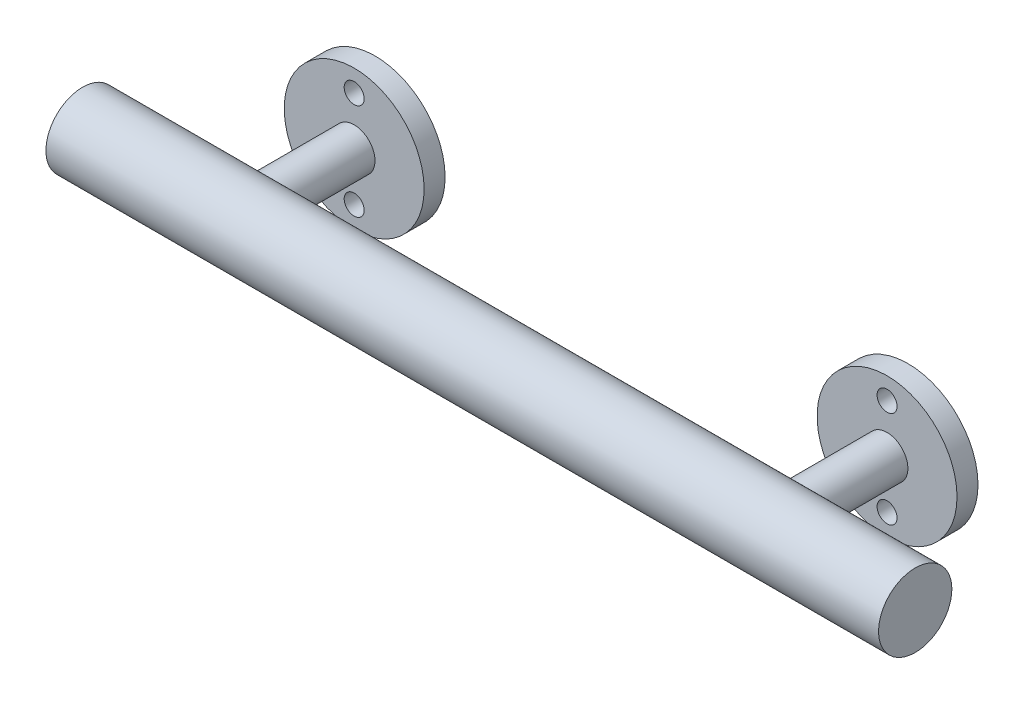
ISO-10303-21;
HEADER;
FILE_DESCRIPTION(('STEP AP214'),'2;1');
FILE_NAME('part.step','',(''),(''),'','','');
FILE_SCHEMA(('AUTOMOTIVE_DESIGN { 1 0 10303 214 1 1 1 1 }'));
ENDSEC;
DATA;
#1=APPLICATION_CONTEXT('core data for automotive mechanical design processes');
#2=APPLICATION_PROTOCOL_DEFINITION('international standard','automotive_design',2000,#1);
#3=PRODUCT_CONTEXT('',#1,'mechanical');
#4=PRODUCT('Part','Part','',(#3));
#5=PRODUCT_RELATED_PRODUCT_CATEGORY('part','',(#4));
#6=PRODUCT_DEFINITION_FORMATION('','',#4);
#7=PRODUCT_DEFINITION_CONTEXT('part definition',#1,'design');
#8=PRODUCT_DEFINITION('design','',#6,#7);
#9=PRODUCT_DEFINITION_SHAPE('','',#8);
#10=(LENGTH_UNIT() NAMED_UNIT(*) SI_UNIT(.MILLI.,.METRE.));
#11=(NAMED_UNIT(*) PLANE_ANGLE_UNIT() SI_UNIT($,.RADIAN.));
#12=(NAMED_UNIT(*) SI_UNIT($,.STERADIAN.) SOLID_ANGLE_UNIT());
#13=UNCERTAINTY_MEASURE_WITH_UNIT(LENGTH_MEASURE(1.E-05),#10,'distance_accuracy_value','');
#14=(GEOMETRIC_REPRESENTATION_CONTEXT(3) GLOBAL_UNCERTAINTY_ASSIGNED_CONTEXT((#13)) GLOBAL_UNIT_ASSIGNED_CONTEXT((#10,
#11,#12)) REPRESENTATION_CONTEXT('',''));
#15=CARTESIAN_POINT('',(0.,0.,0.));
#16=DIRECTION('',(0.,0.,1.));
#17=DIRECTION('',(1.,0.,0.));
#18=AXIS2_PLACEMENT_3D('',#15,#16,#17);
#19=CARTESIAN_POINT('',(-110.,0.,42.0519334951158));
#20=DIRECTION('',(1.,0.,0.));
#21=DIRECTION('',(0.,0.,-1.));
#22=AXIS2_PLACEMENT_3D('',#19,#20,#21);
#23=CYLINDRICAL_SURFACE('',#22,11.);
#24=CARTESIAN_POINT('',(140.,0.,42.0519334951158));
#25=DIRECTION('',(1.,0.,0.));
#26=DIRECTION('',(0.,0.,-1.));
#27=AXIS2_PLACEMENT_3D('',#24,#25,#26);
#28=CIRCLE('',#27,11.);
#29=CARTESIAN_POINT('',(140.,0.,31.0519334951158));
#30=VERTEX_POINT('',#29);
#31=EDGE_CURVE('E101',#30,#30,#28,.T.);
#32=ORIENTED_EDGE('',*,*,#31,.F.);
#33=EDGE_LOOP('',(#32));
#34=FACE_BOUND('',#33,.T.);
#35=CARTESIAN_POINT('',(-110.,0.,42.0519334951158));
#36=DIRECTION('',(1.,0.,0.));
#37=DIRECTION('',(0.,0.,-1.));
#38=AXIS2_PLACEMENT_3D('',#35,#36,#37);
#39=CIRCLE('',#38,11.);
#40=CARTESIAN_POINT('',(-110.,0.,31.0519334951158));
#41=VERTEX_POINT('',#40);
#42=EDGE_CURVE('E104',#41,#41,#39,.T.);
#43=ORIENTED_EDGE('',*,*,#42,.T.);
#44=EDGE_LOOP('',(#43));
#45=FACE_BOUND('',#44,.T.);
#46=CARTESIAN_POINT('',(-64.2026431718062,6.25,33.));
#47=CARTESIAN_POINT('',(-64.0434405837907,6.24999937136487,32.9999991187482));
#48=CARTESIAN_POINT('',(-63.8842289150577,6.24390777915526,32.9957843524336));
#49=CARTESIAN_POINT('',(-63.5671634941966,6.21964253217894,32.979102698203));
#50=CARTESIAN_POINT('',(-63.4093098564348,6.20146786973566,32.9666351220381));
#51=CARTESIAN_POINT('',(-63.0961251432963,6.15331116050535,32.9339509796096));
#52=CARTESIAN_POINT('',(-62.9407959134038,6.12332084739676,32.9137289885617));
#53=CARTESIAN_POINT('',(-62.6338082885961,6.05195075629456,32.8663075782992));
#54=CARTESIAN_POINT('',(-62.4821515617625,6.01056590458998,32.8391050511894));
#55=CARTESIAN_POINT('',(-62.1845101857211,5.91724560049291,32.7788940145012));
#56=CARTESIAN_POINT('',(-62.0384935538908,5.86538512178775,32.7459269748142));
#57=CARTESIAN_POINT('',(-61.7517052081969,5.75145466479171,32.6750860210497));
#58=CARTESIAN_POINT('',(-61.6109354641773,5.68938089853994,32.6372102875195));
#59=CARTESIAN_POINT('',(-61.1974442056008,5.48863558914412,32.5178310238935));
#60=CARTESIAN_POINT('',(-60.9333480797537,5.3353788468308,32.430534086262));
#61=CARTESIAN_POINT('',(-60.4046356026273,4.97501995072822,32.2389280958422));
#62=CARTESIAN_POINT('',(-60.1430673381843,4.76388137018914,32.1338007582532));
#63=CARTESIAN_POINT('',(-59.7784181971214,4.41779038731103,31.9772492497927));
#64=CARTESIAN_POINT('',(-59.6614184363048,4.29744143355594,31.9252217667893));
#65=CARTESIAN_POINT('',(-59.4371393923202,4.0473056773403,31.8226830588214));
#66=CARTESIAN_POINT('',(-59.3298617908834,3.91751724901943,31.7721720971901));
#67=CARTESIAN_POINT('',(-59.1161073719666,3.63643881645987,31.6692185605069));
#68=CARTESIAN_POINT('',(-59.0106511012825,3.48427411264601,31.6170397794352));
#69=CARTESIAN_POINT('',(-58.8131048551951,3.17013906047401,31.5173545103875));
#70=CARTESIAN_POINT('',(-58.7210089948424,3.00817307417766,31.4698459682713));
#71=CARTESIAN_POINT('',(-58.5511213936663,2.67538553838118,31.3808527518929));
#72=CARTESIAN_POINT('',(-58.4733244532826,2.5045672369571,31.3393658891076));
#73=CARTESIAN_POINT('',(-58.3329826870095,2.15522690496327,31.2636565000364));
#74=CARTESIAN_POINT('',(-58.2704356665899,1.97670598719057,31.2294329286229));
#75=CARTESIAN_POINT('',(-58.1662810699126,1.62934678494944,31.1719770132301));
#76=CARTESIAN_POINT('',(-58.1233192998897,1.46102994572393,31.1480445266223));
#77=CARTESIAN_POINT('',(-58.0514478642795,1.12052009295118,31.1078111262122));
#78=CARTESIAN_POINT('',(-58.02253744857,0.94832728683347,31.0915098050269));
#79=CARTESIAN_POINT('',(-57.979221093909,0.60167210321689,31.0670273417006));
#80=CARTESIAN_POINT('',(-57.9648052351433,0.427211360792804,31.0588406461103));
#81=CARTESIAN_POINT('',(-57.9506749940271,0.0775095769239728,31.0508167248438));
#82=CARTESIAN_POINT('',(-57.9509593355302,-0.0977313954671912,31.0509787744005));
#83=CARTESIAN_POINT('',(-57.9653630850676,-0.427778552495635,31.0591568838607));
#84=CARTESIAN_POINT('',(-57.9779309628998,-0.582677326115649,31.0662921497533));
#85=CARTESIAN_POINT('',(-58.0144975308529,-0.890740469322179,31.0869702929905));
#86=CARTESIAN_POINT('',(-58.0384999931855,-1.04390424945981,31.1005152848616));
#87=CARTESIAN_POINT('',(-58.0976384169811,-1.3473316216047,31.1336925627294));
#88=CARTESIAN_POINT('',(-58.1327704418333,-1.49759621916787,31.1533226963128));
#89=CARTESIAN_POINT('',(-58.2137907691425,-1.7943861899477,31.1982374777327));
#90=CARTESIAN_POINT('',(-58.2596832674728,-1.94091007975833,31.2235243311391));
#91=CARTESIAN_POINT('',(-58.3622001048363,-2.23059038731292,31.2794494968235));
#92=CARTESIAN_POINT('',(-58.4189147931651,-2.37370614573285,31.310132678236));
#93=CARTESIAN_POINT('',(-58.5422917591857,-2.65451796871249,31.3760555797863));
#94=CARTESIAN_POINT('',(-58.6089573699941,-2.79221219769561,31.4112968261432));
#95=CARTESIAN_POINT('',(-58.8230529577358,-3.19613801711498,31.5228040684991));
#96=CARTESIAN_POINT('',(-58.9846474380338,-3.45339649036308,31.6048904154085));
#97=CARTESIAN_POINT('',(-59.3615031092557,-3.96717959366452,31.7882088377882));
#98=CARTESIAN_POINT('',(-59.5807527065862,-4.22037896821687,31.8905557454166));
#99=CARTESIAN_POINT('',(-59.9371391126875,-4.57119808633664,32.0459043572495));
#100=CARTESIAN_POINT('',(-60.0606464978894,-4.68339782478107,32.098040843411));
#101=CARTESIAN_POINT('',(-60.3164335118546,-4.89772439843027,32.2017332128646));
#102=CARTESIAN_POINT('',(-60.4487146942494,-4.99984944163886,32.2532889914261));
#103=CARTESIAN_POINT('',(-60.7348987815945,-5.20297915053324,32.3594927296144));
#104=CARTESIAN_POINT('',(-60.8896498990924,-5.30289179988001,32.4139481132611));
#105=CARTESIAN_POINT('',(-61.2083952528336,-5.48917512689041,32.5188132372557));
#106=CARTESIAN_POINT('',(-61.3723884552716,-5.57554731509802,32.5692234285695));
#107=CARTESIAN_POINT('',(-61.7086023956661,-5.73382391278642,32.6640812369823));
#108=CARTESIAN_POINT('',(-61.8808118713489,-5.80574746021051,32.7085367150215));
#109=CARTESIAN_POINT('',(-62.2325849525372,-5.93434131160055,32.7896774882862));
#110=CARTESIAN_POINT('',(-62.4121459993208,-5.99101687151063,32.8263654600208));
#111=CARTESIAN_POINT('',(-62.7358248691087,-6.07719437078896,32.8829791200408));
#112=CARTESIAN_POINT('',(-62.8787508753042,-6.1099438051923,32.9048193132547));
#113=CARTESIAN_POINT('',(-63.1673487955614,-6.16540703490337,32.9421103171288));
#114=CARTESIAN_POINT('',(-63.3130201734711,-6.18812276897522,32.9575623621034));
#115=CARTESIAN_POINT('',(-63.6060579044108,-6.22321015718636,32.9815361189242));
#116=CARTESIAN_POINT('',(-63.7534228508667,-6.2355898437192,32.9900632121776));
#117=CARTESIAN_POINT('',(-64.0489075635418,-6.24985945325785,32.9998987363379));
#118=CARTESIAN_POINT('',(-64.1970273491713,-6.25174910514193,33.001206980669));
#119=CARTESIAN_POINT('',(-64.4929567086438,-6.24500836283561,32.9965546087257));
#120=CARTESIAN_POINT('',(-64.6407661743789,-6.23637476735562,32.9905917805095));
#121=CARTESIAN_POINT('',(-64.9349971561964,-6.20870392380428,32.9716100054743));
#122=CARTESIAN_POINT('',(-65.0814181466397,-6.18966288409852,32.9585884870513));
#123=CARTESIAN_POINT('',(-65.371863403607,-6.14142448206922,32.9259403053471));
#124=CARTESIAN_POINT('',(-65.515887098176,-6.1122247314326,32.9063120888663));
#125=CARTESIAN_POINT('',(-65.8006639483885,-6.04403036031061,32.8611031687162));
#126=CARTESIAN_POINT('',(-65.9414157448892,-6.00503174610614,32.8355200383186));
#127=CARTESIAN_POINT('',(-66.3613388088826,-5.87275784301936,32.7502204878281));
#128=CARTESIAN_POINT('',(-66.6344135863584,-5.76483883258236,32.6824078132101));
#129=CARTESIAN_POINT('',(-67.1595134231113,-5.51401536455263,32.5326411082135));
#130=CARTESIAN_POINT('',(-67.4115297676408,-5.37109651798172,32.4506812658144));
#131=CARTESIAN_POINT('',(-67.9315283084423,-5.02695733935959,32.2655268536246));
#132=CARTESIAN_POINT('',(-68.1953142887597,-4.82001333200939,32.1610572796064));
#133=CARTESIAN_POINT('',(-68.5636810581279,-4.48016227483486,32.0048543968568));
#134=CARTESIAN_POINT('',(-68.6819952369714,-4.36187445431509,31.9528321018112));
#135=CARTESIAN_POINT('',(-68.9090687178539,-4.11583099412639,31.8500863804819));
#136=CARTESIAN_POINT('',(-69.0178264690781,-3.9880738239524,31.7993631659554));
#137=CARTESIAN_POINT('',(-69.2352050607887,-3.71076909557235,31.6955735663942));
#138=CARTESIAN_POINT('',(-69.3427858369507,-3.56031043100301,31.6427583782694));
#139=CARTESIAN_POINT('',(-69.5447341498813,-3.24944564845764,31.541566978614));
#140=CARTESIAN_POINT('',(-69.6391073626879,-3.08904384664069,31.4931888633218));
#141=CARTESIAN_POINT('',(-69.8137097505887,-2.75920921833872,31.4022379179205));
#142=CARTESIAN_POINT('',(-69.8939439771777,-2.58977964553425,31.3596630157096));
#143=CARTESIAN_POINT('',(-70.0393191359111,-2.24299922445792,31.2815795218023));
#144=CARTESIAN_POINT('',(-70.1044621494508,-2.06564947257441,31.2460699557431));
#145=CARTESIAN_POINT('',(-70.2140345766086,-1.71927580041471,31.1858205272202));
#146=CARTESIAN_POINT('',(-70.2597249881954,-1.55076270642787,31.16043606666));
#147=CARTESIAN_POINT('',(-70.3369762508905,-1.20956387701328,31.1172861161657));
#148=CARTESIAN_POINT('',(-70.3685377843596,-1.03687834352004,31.0995202582894));
#149=CARTESIAN_POINT('',(-70.4170361040284,-0.688949091633129,31.0721439304498));
#150=CARTESIAN_POINT('',(-70.433983359457,-0.513707296139593,31.0625276224797));
#151=CARTESIAN_POINT('',(-70.453017452224,-0.162165427951494,31.0517237262079));
#152=CARTESIAN_POINT('',(-70.4551056874493,0.0141345436315707,31.0505353450351));
#153=CARTESIAN_POINT('',(-70.4450108037303,0.345900702205445,31.0562686914144));
#154=CARTESIAN_POINT('',(-70.4344386829726,0.50143490444939,31.0622749449329));
#155=CARTESIAN_POINT('',(-70.4017624234913,0.810951532266845,31.0807714358458));
#156=CARTESIAN_POINT('',(-70.3796544819183,0.964933429041064,31.0932638114207));
#157=CARTESIAN_POINT('',(-70.3241840884538,1.27015339916448,31.1244343300395));
#158=CARTESIAN_POINT('',(-70.2908257777567,1.42139246058041,31.1431101969308));
#159=CARTESIAN_POINT('',(-70.2132205908369,1.72026408721151,31.1862305265116));
#160=CARTESIAN_POINT('',(-70.1689694684683,1.8678952212853,31.2106772385915));
#161=CARTESIAN_POINT('',(-70.069896480849,2.15906317213796,31.2648840792557));
#162=CARTESIAN_POINT('',(-70.0150437144355,2.30258657650594,31.294659721097));
#163=CARTESIAN_POINT('',(-69.8953615313781,2.58435920387497,31.3588515387236));
#164=CARTESIAN_POINT('',(-69.8305287666064,2.72260663737748,31.3932692713736));
#165=CARTESIAN_POINT('',(-69.6218811428123,3.12838396660644,31.5024542787103));
#166=CARTESIAN_POINT('',(-69.4638513386978,3.38713955885252,31.5831902445289));
#167=CARTESIAN_POINT('',(-69.094820790397,3.90394162589374,31.76396802829));
#168=CARTESIAN_POINT('',(-68.8799092193566,4.15879120314302,31.865156258198));
#169=CARTESIAN_POINT('',(-68.5300479048621,4.51261211826602,32.0193367082242));
#170=CARTESIAN_POINT('',(-68.4087213062692,4.62590091859423,32.0711784888941));
#171=CARTESIAN_POINT('',(-68.1573026044824,4.84259222210828,32.1745003252426));
#172=CARTESIAN_POINT('',(-68.0272089428409,4.94599295963132,32.225980314803));
#173=CARTESIAN_POINT('',(-67.745062147781,5.15241413185686,32.3324958339259));
#174=CARTESIAN_POINT('',(-67.5921234506194,5.2543162216363,32.387357209797));
#175=CARTESIAN_POINT('',(-67.2769123629613,5.44474648456294,32.4933451811912));
#176=CARTESIAN_POINT('',(-67.1146409212639,5.53327601390401,32.544472155171));
#177=CARTESIAN_POINT('',(-66.7817453160978,5.69605263998029,32.6410921091765));
#178=CARTESIAN_POINT('',(-66.611132451927,5.77031842081495,32.6865924313314));
#179=CARTESIAN_POINT('',(-66.2623797264935,5.90379644538545,32.7701556906351));
#180=CARTESIAN_POINT('',(-66.0842425725639,5.96301405073074,32.8082212756314));
#181=CARTESIAN_POINT('',(-65.7662316846202,6.05292559644652,32.8669337904126));
#182=CARTESIAN_POINT('',(-65.6276855623752,6.08705320064064,32.8895631645366));
#183=CARTESIAN_POINT('',(-65.3477873731213,6.14585899912806,32.9289036627505));
#184=CARTESIAN_POINT('',(-65.2064359039236,6.17053918437226,32.945616033735));
#185=CARTESIAN_POINT('',(-64.921826683762,6.21014548442027,32.9725794778435));
#186=CARTESIAN_POINT('',(-64.7785698803839,6.22507627550658,32.9828336485498));
#187=CARTESIAN_POINT('',(-64.4910920268009,6.24500210784115,32.9965431385471));
#188=CARTESIAN_POINT('',(-64.3468713257082,6.25000056950635,33.0000007983622));
#189=CARTESIAN_POINT('',(-64.2026431718062,6.25,33.));
#190=B_SPLINE_CURVE_WITH_KNOTS('',3,(#46,#47,#48,#49,#50,#51,#52,#53,#54,#55,#56,#57,#58,#59,
#60,#61,#62,#63,#64,#65,#66,#67,#68,#69,#70,#71,#72,#73,#74,#75,#76,#77,#78,#79,#80,#81,#82,#83,
#84,#85,#86,#87,#88,#89,#90,#91,#92,#93,#94,#95,#96,#97,#98,#99,#100,#101,#102,#103,#104,#105,
#106,#107,#108,#109,#110,#111,#112,#113,#114,#115,#116,#117,#118,#119,#120,#121,#122,#123,#124,
#125,#126,#127,#128,#129,#130,#131,#132,#133,#134,#135,#136,#137,#138,#139,#140,#141,#142,#143,
#144,#145,#146,#147,#148,#149,#150,#151,#152,#153,#154,#155,#156,#157,#158,#159,#160,#161,#162,
#163,#164,#165,#166,#167,#168,#169,#170,#171,#172,#173,#174,#175,#176,#177,#178,#179,#180,#181,
#182,#183,#184,#185,#186,#187,#188,#189),.UNSPECIFIED.,.T.,.F.,(4,2,2,2,2,2,2,2,2,2,2,2,2,2,2,2,
2,2,2,2,2,2,2,2,2,2,2,2,2,2,2,2,2,2,2,2,2,2,2,2,2,2,2,2,2,2,2,2,2,2,2,2,2,2,2,2,2,2,2,2,2,2,2,2,
2,2,2,2,2,2,2,4),(0.,0.477453543452045,0.954946909490827,1.43277492851675,1.91081605779506,
2.38554992639329,2.8604602654715,3.80966878389376,4.86179161191623,5.38854063682824,
5.91538060513386,6.49167736510658,7.067719503986,7.64355175867352,8.21930109960981,
8.74462233803109,9.2699155294437,9.79484897443561,10.3197368492487,10.7858963479274,
11.2522097368758,11.7183583710442,12.1846890755425,12.6550982637472,13.1256653731797,
14.0662100931917,15.1123536097449,15.6363924197977,16.1605242737306,16.736056012467,
17.3115235003938,17.8862236529776,18.4607254532741,18.9050047624319,19.3491981880219,
19.7930460979655,20.2369054793925,20.6808999215172,21.1250562273781,21.5693170250354,
22.0137591844407,22.9140477410514,23.8147070435036,24.8635647946805,25.3887702669762,
25.9140608126836,26.4903906071464,27.066471954437,27.6423470635982,28.2181427001365,
28.7466941292832,29.2752200290419,29.8033669934699,30.331464270942,30.7989295610422,
31.2665490512023,31.7339966009266,32.2016266565571,32.6706408733158,33.13981278106,
34.0775481896227,35.1182382854713,35.6395397028242,36.1609340332694,36.7356021114811,
37.310211869871,37.8840637347154,38.4577108506715,38.8907037238408,39.3236052977066,
39.7562990781497,40.1888438250939),.UNSPECIFIED.);
#191=CARTESIAN_POINT('',(-64.2026431718062,6.25,33.));
#192=VERTEX_POINT('',#191);
#193=EDGE_CURVE('E107',#192,#192,#190,.T.);
#194=ORIENTED_EDGE('',*,*,#193,.F.);
#195=EDGE_LOOP('',(#194));
#196=FACE_BOUND('',#195,.T.);
#197=CARTESIAN_POINT('',(89.5473568281938,0.,31.0519334951158));
#198=CARTESIAN_POINT('',(89.5473581662124,-0.161344429888011,31.051934704276));
#199=CARTESIAN_POINT('',(89.5536145444253,-0.322743243216501,31.0554927497548));
#200=CARTESIAN_POINT('',(89.578565128703,-0.644338317337545,31.0696401257035));
#201=CARTESIAN_POINT('',(89.5972673650023,-0.804533734152929,31.0802339957729));
#202=CARTESIAN_POINT('',(89.6469176706789,-1.12275526707993,31.1082147403214));
#203=CARTESIAN_POINT('',(89.6778908353478,-1.28077624665824,31.1256155347253));
#204=CARTESIAN_POINT('',(89.7517059284368,-1.5932333218379,31.166784998335));
#205=CARTESIAN_POINT('',(89.7945529317051,-1.74766785394491,31.1905563901745));
#206=CARTESIAN_POINT('',(89.8913648460771,-2.05109266326529,31.2437600912243));
#207=CARTESIAN_POINT('',(89.9452705041998,-2.20010716795551,31.2731621771719));
#208=CARTESIAN_POINT('',(90.0637877216235,-2.49271589113976,31.3370450091686));
#209=CARTESIAN_POINT('',(90.1284033285469,-2.63630803506723,31.3715276747771));
#210=CARTESIAN_POINT('',(90.3373415757495,-3.05758851988309,31.4814486956539));
#211=CARTESIAN_POINT('',(90.4968844547141,-3.32617947793401,31.5634329420189));
#212=CARTESIAN_POINT('',(90.8647300279605,-3.8525523242941,31.7446125010592));
#213=CARTESIAN_POINT('',(91.0757098932376,-4.10817595606118,31.8446206458141));
#214=CARTESIAN_POINT('',(91.4195584278714,-4.46370309396952,31.9974765879531));
#215=CARTESIAN_POINT('',(91.5388569351681,-4.57765030750637,32.0489499235072));
#216=CARTESIAN_POINT('',(91.7861803069067,-4.79584701197868,32.1517126012407));
#217=CARTESIAN_POINT('',(91.9142067581465,-4.90009473129106,32.2030019081687));
#218=CARTESIAN_POINT('',(92.1926587510372,-5.10902340370174,32.3095992154793));
#219=CARTESIAN_POINT('',(92.3440134925452,-5.21254967190322,32.3647476146194));
#220=CARTESIAN_POINT('',(92.6561247189283,-5.40637563636773,32.471570873065));
#221=CARTESIAN_POINT('',(92.8168803660817,-5.49667650865029,32.5232460409933));
#222=CARTESIAN_POINT('',(93.1468725837333,-5.6631748150546,32.6212507475422));
#223=CARTESIAN_POINT('',(93.3160995184076,-5.73938783037863,32.667586170306));
#224=CARTESIAN_POINT('',(93.6622209065503,-5.87693316851264,32.7531042579155));
#225=CARTESIAN_POINT('',(93.8391128608303,-5.93827029922696,32.7922892327782));
#226=CARTESIAN_POINT('',(94.1598362863355,-6.03345325318476,32.8541122737593));
#227=CARTESIAN_POINT('',(94.3024243400813,-6.07037787909012,32.8784947658039));
#228=CARTESIAN_POINT('',(94.590728021526,-6.13419366501374,32.9210439539635));
#229=CARTESIAN_POINT('',(94.7364429845158,-6.16108693555569,32.9392119574944));
#230=CARTESIAN_POINT('',(95.0299729948309,-6.20448331500772,32.9687029451421));
#231=CARTESIAN_POINT('',(95.1777861105641,-6.22099541762841,32.9800318539597));
#232=CARTESIAN_POINT('',(95.4745976574206,-6.24343454853375,32.9954599849825));
#233=CARTESIAN_POINT('',(95.6235961124026,-6.24936136321126,32.9995590612924));
#234=CARTESIAN_POINT('',(95.9218494616053,-6.25054154415503,33.0003739004781));
#235=CARTESIAN_POINT('',(96.0711044374702,-6.24578103149913,32.9970800626687));
#236=CARTESIAN_POINT('',(96.3685501047179,-6.2256292696467,32.9832131876399));
#237=CARTESIAN_POINT('',(96.5167407920205,-6.21023797971663,32.9726401225291));
#238=CARTESIAN_POINT('',(96.8110552684608,-6.16903604526227,32.9445951121475));
#239=CARTESIAN_POINT('',(96.957178236667,-6.14322137625137,32.9271205022342));
#240=CARTESIAN_POINT('',(97.2464189242022,-6.08149648826705,32.8858669810148));
#241=CARTESIAN_POINT('',(97.3895354051081,-6.04558219344359,32.8620855247108));
#242=CARTESIAN_POINT('',(97.6714298630538,-5.96420964597079,32.8090686964581));
#243=CARTESIAN_POINT('',(97.8102211834575,-5.91878497845068,32.7798525561176));
#244=CARTESIAN_POINT('',(98.0833772770735,-5.81874412480263,32.7167467531672));
#245=CARTESIAN_POINT('',(98.2177405777716,-5.76412491723522,32.6828555549388));
#246=CARTESIAN_POINT('',(98.6133501490113,-5.58713838207253,32.5754923316498));
#247=CARTESIAN_POINT('',(98.8672551643334,-5.45160147613317,32.4963030336655));
#248=CARTESIAN_POINT('',(99.3906884511418,-5.12447687283665,32.3164447614949));
#249=CARTESIAN_POINT('',(99.6563102934829,-4.92740930077301,32.2143608984564));
#250=CARTESIAN_POINT('',(100.028766074195,-4.60270243124974,32.0604585235715));
#251=CARTESIAN_POINT('',(100.148667391157,-4.48952157361352,32.0089900239687));
#252=CARTESIAN_POINT('',(100.379378260634,-4.25379469975456,31.9068998378481));
#253=CARTESIAN_POINT('',(100.490186282705,-4.13124711374232,31.8562782950141));
#254=CARTESIAN_POINT('',(100.713941774159,-3.86309441567865,31.7514735621069));
#255=CARTESIAN_POINT('',(100.825746834366,-3.71644257055115,31.697523740147));
#256=CARTESIAN_POINT('',(101.036486918879,-3.41293545779387,31.5935594637223));
#257=CARTESIAN_POINT('',(101.13542718184,-3.25608438265515,31.5435434106925));
#258=CARTESIAN_POINT('',(101.31954238243,-2.93300615039012,31.4488300658722));
#259=CARTESIAN_POINT('',(101.404720364266,-2.76678107778904,31.4041315984146));
#260=CARTESIAN_POINT('',(101.560353151606,-2.42599435245017,31.3213565165423));
#261=CARTESIAN_POINT('',(101.630809777589,-2.25143373378979,31.2832790834524));
#262=CARTESIAN_POINT('',(101.751693460711,-1.90767538182455,31.2173018238191));
#263=CARTESIAN_POINT('',(101.803172261277,-1.73894812067031,31.1888785716489));
#264=CARTESIAN_POINT('',(101.891861612208,-1.39669386213217,31.1395952107315));
#265=CARTESIAN_POINT('',(101.929072691061,-1.22316704278327,31.118734821851));
#266=CARTESIAN_POINT('',(101.988641177231,-0.872940257990418,31.0852158608919));
#267=CARTESIAN_POINT('',(102.011010513231,-0.696242958349841,31.0725507023032));
#268=CARTESIAN_POINT('',(102.040578410152,-0.34118587518082,31.0557903233894));
#269=CARTESIAN_POINT('',(102.047778625181,-0.162826275047594,31.0516941686626));
#270=CARTESIAN_POINT('',(102.046949532294,0.172419429239934,31.0521646219955));
#271=CARTESIAN_POINT('',(102.040643720188,0.329314549421493,31.0557508901056));
#272=CARTESIAN_POINT('',(102.016278622653,0.641949912753475,31.0695664358772));
#273=CARTESIAN_POINT('',(101.998215462934,0.797689758101835,31.0797979032661));
#274=CARTESIAN_POINT('',(101.950568109369,1.10676725553948,31.1066549262951));
#275=CARTESIAN_POINT('',(101.920988462203,1.26010583082342,31.1232779585287));
#276=CARTESIAN_POINT('',(101.850647818857,1.56346555997816,31.1625358507193));
#277=CARTESIAN_POINT('',(101.809882506844,1.71348540917236,31.1851730310436));
#278=CARTESIAN_POINT('',(101.718047625608,2.00785126929417,31.2357131824339));
#279=CARTESIAN_POINT('',(101.667077454178,2.15223708275266,31.2635652019551));
#280=CARTESIAN_POINT('',(101.555091145497,2.43604054154417,31.3240821280828));
#281=CARTESIAN_POINT('',(101.494071519247,2.57545644088645,31.3567487058062));
#282=CARTESIAN_POINT('',(101.296741330231,2.98513894212714,31.4609856976816));
#283=CARTESIAN_POINT('',(101.146094471182,3.24704616373353,31.5388301141548));
#284=CARTESIAN_POINT('',(100.793291769193,3.76998596479612,31.7140892670595));
#285=CARTESIAN_POINT('',(100.58740937865,4.02809750834122,31.8126971855836));
#286=CARTESIAN_POINT('',(100.251100839715,4.38790178070302,31.9641511631302));
#287=CARTESIAN_POINT('',(100.134302117375,4.50336565925804,32.0152727765793));
#288=CARTESIAN_POINT('',(99.8920102585656,4.72475132325295,32.1175687777737));
#289=CARTESIAN_POINT('',(99.7665156209467,4.83067145388806,32.168743173121));
#290=CARTESIAN_POINT('',(99.3492188188563,5.15552215951813,32.3316890084001));
#291=CARTESIAN_POINT('',(99.0408744591301,5.35512456327342,32.441419957504));
#292=CARTESIAN_POINT('',(98.5527033570741,5.61288847778487,32.5912018223649));
#293=CARTESIAN_POINT('',(98.3857131543222,5.69186683940313,32.6386579553971));
#294=CARTESIAN_POINT('',(98.0438258848712,5.83525177544125,32.7268650190675));
#295=CARTESIAN_POINT('',(97.8689312594331,5.89966281253833,32.767618002159));
#296=CARTESIAN_POINT('',(97.5503796621226,6.00092639802341,32.8328390515442));
#297=CARTESIAN_POINT('',(97.4079815210939,6.04072656113572,32.8589274288458));
#298=CARTESIAN_POINT('',(97.1197953811202,6.11028738841814,32.9050142614939));
#299=CARTESIAN_POINT('',(96.9740081047205,6.14005017189756,32.9250140023185));
#300=CARTESIAN_POINT('',(96.6800567834414,6.18914576790372,32.9582347911597));
#301=CARTESIAN_POINT('',(96.5318950252394,6.2084880591973,32.9714619991135));
#302=CARTESIAN_POINT('',(96.2340916825658,6.23651573505552,32.9906884083943));
#303=CARTESIAN_POINT('',(96.0844500738353,6.24520094462746,32.9966874910331));
#304=CARTESIAN_POINT('',(95.7845368854562,6.25178966223831,33.0012350119446));
#305=CARTESIAN_POINT('',(95.6342646522893,6.24967316296732,32.9997696242691));
#306=CARTESIAN_POINT('',(95.3345233263155,6.23464568292605,32.9894131854212));
#307=CARTESIAN_POINT('',(95.1850542364743,6.22173466232393,32.980522106848));
#308=CARTESIAN_POINT('',(94.8879612572183,6.18529700120632,32.9556382229364));
#309=CARTESIAN_POINT('',(94.7403380295857,6.16176665957877,32.9396429416278));
#310=CARTESIAN_POINT('',(94.4479511150179,6.10441127391656,32.9011224800659));
#311=CARTESIAN_POINT('',(94.30318860766,6.07058207387469,32.8785946638444));
#312=CARTESIAN_POINT('',(93.8787211816679,5.95535904041063,32.8030345783683));
#313=CARTESIAN_POINT('',(93.6042515248927,5.85964779825619,32.7416023902044));
#314=CARTESIAN_POINT('',(93.0747146664694,5.63319462782271,32.6028783372402));
#315=CARTESIAN_POINT('',(92.8196547492402,5.50243963015975,32.5255805579749));
#316=CARTESIAN_POINT('',(92.2943267247756,5.18643385580631,32.3494372017541));
#317=CARTESIAN_POINT('',(92.0277339079441,4.99589886761577,32.2491053461394));
#318=CARTESIAN_POINT('',(91.5276836676891,4.57592010927509,32.0461705447224));
#319=CARTESIAN_POINT('',(91.2942546770349,4.34644331808582,31.9435657362891));
#320=CARTESIAN_POINT('',(90.959348526623,3.96104030852451,31.7887708463568));
#321=CARTESIAN_POINT('',(90.8449508934012,3.81708491709711,31.7342335119201));
#322=CARTESIAN_POINT('',(90.6287547885196,3.51879932413167,31.6287366214046));
#323=CARTESIAN_POINT('',(90.5269516852804,3.36447296887921,31.5777757530983));
#324=CARTESIAN_POINT('',(90.3368434327776,3.04625143108366,31.4808396902879));
#325=CARTESIAN_POINT('',(90.2485370791133,2.8823571041572,31.4348640510268));
#326=CARTESIAN_POINT('',(90.0863865462769,2.54600622840081,31.3492264032185));
#327=CARTESIAN_POINT('',(90.0125383755259,2.3735520592785,31.3095626526686));
#328=CARTESIAN_POINT('',(89.8919887997572,2.05258041324796,31.2441219686738));
#329=CARTESIAN_POINT('',(89.8427956754684,1.9052415216415,31.2171297508746));
#330=CARTESIAN_POINT('',(89.7553362294281,1.60645696824524,31.1688189753653));
#331=CARTESIAN_POINT('',(89.7170679823429,1.45501203523673,31.1474994179853));
#332=CARTESIAN_POINT('',(89.6519646373572,1.14935417040715,31.1110642586858));
#333=CARTESIAN_POINT('',(89.6251011967701,0.995149104797243,31.0959332806728));
#334=CARTESIAN_POINT('',(89.5830059176548,0.684725413912738,31.0721633417566));
#335=CARTESIAN_POINT('',(89.5677672469402,0.528508026322572,31.0635205676111));
#336=CARTESIAN_POINT('',(89.5547407466943,0.309989402589735,31.0561274898376));
#337=CARTESIAN_POINT('',(89.5519728056353,0.248039972904727,31.0545556631383));
#338=CARTESIAN_POINT('',(89.5482805045412,0.12406304647571,31.0524583852958));
#339=CARTESIAN_POINT('',(89.5473563137372,0.0620355430884032,31.0519330302042));
#340=CARTESIAN_POINT('',(89.5473568281938,0.,31.0519334951158));
#341=B_SPLINE_CURVE_WITH_KNOTS('',3,(#197,#198,#199,#200,#201,#202,#203,#204,#205,#206,#207,
#208,#209,#210,#211,#212,#213,#214,#215,#216,#217,#218,#219,#220,#221,#222,#223,#224,#225,#226,
#227,#228,#229,#230,#231,#232,#233,#234,#235,#236,#237,#238,#239,#240,#241,#242,#243,#244,#245,
#246,#247,#248,#249,#250,#251,#252,#253,#254,#255,#256,#257,#258,#259,#260,#261,#262,#263,#264,
#265,#266,#267,#268,#269,#270,#271,#272,#273,#274,#275,#276,#277,#278,#279,#280,#281,#282,#283,
#284,#285,#286,#287,#288,#289,#290,#291,#292,#293,#294,#295,#296,#297,#298,#299,#300,#301,#302,
#303,#304,#305,#306,#307,#308,#309,#310,#311,#312,#313,#314,#315,#316,#317,#318,#319,#320,#321,
#322,#323,#324,#325,#326,#327,#328,#329,#330,#331,#332,#333,#334,#335,#336,#337,#338,#339,#340),
.UNSPECIFIED.,.T.,.F.,(4,2,2,2,2,2,2,2,2,2,2,2,2,2,2,2,2,2,2,2,2,2,2,2,2,2,2,2,2,2,2,2,2,2,2,2,
2,2,2,2,2,2,2,2,2,2,2,2,2,2,2,2,2,2,2,2,2,2,2,2,2,2,2,2,2,2,2,2,2,2,2,4),(0.,0.483968258568243,
0.968249083091152,1.45352546624722,1.93900957601288,2.42195736028915,2.90508808345245,
3.87008861448511,4.90432759630431,5.42237630507125,5.94051945100131,6.51428147414675,
7.0879924466057,7.66106504639855,8.23395218084749,8.68138027989986,9.12871419018979,
9.57566001737708,10.022614863662,10.4701504762259,10.9176878036039,11.3653980914844,
11.8132893192571,12.2596247566729,12.7061071527717,13.5986337680706,14.6326815652778,
15.1504704215385,15.6683462461904,16.2440423663226,16.8195033190043,17.3948368054034,
17.9700991025222,18.5053800231053,19.0406411145151,19.5754714802708,20.1102435227494,
20.5808573312858,21.0516262953143,21.5222095890602,21.9929747067077,22.4593599040523,
22.925907365031,23.858352546461,24.8877262729965,25.4033224273908,25.9190078104268,
27.0622279596328,27.6337791809661,28.2051550705797,28.6551235712867,29.1049970053145,
29.5544605281567,30.0039314312351,30.4542351621391,30.9045405546742,31.3550030118038,
31.8056474903096,32.6931771653427,33.5810383015994,34.6051855880372,35.630205688631,
36.2049654186025,36.7795131510963,37.3540095830823,37.928347185185,38.400832912192,
38.8732353197228,39.3444567636725,39.8154010444237,40.0014655924041,40.1875472177733),.UNSPECIFIED.);
#342=CARTESIAN_POINT('',(89.5473568281938,0.,31.0519334951158));
#343=VERTEX_POINT('',#342);
#344=EDGE_CURVE('E10',#343,#343,#341,.T.);
#345=ORIENTED_EDGE('',*,*,#344,.T.);
#346=EDGE_LOOP('',(#345));
#347=FACE_BOUND('',#346,.T.);
#348=ADVANCED_FACE('F30',(#34,#45,#196,#347),#23,.T.);
#349=CARTESIAN_POINT('',(-64.2026431718062,0.,6.3));
#350=DIRECTION('',(0.,0.,-1.));
#351=DIRECTION('',(-1.,0.,0.));
#352=AXIS2_PLACEMENT_3D('',#349,#350,#351);
#353=CYLINDRICAL_SURFACE('',#352,21.);
#354=CARTESIAN_POINT('',(-64.2026431718062,0.,6.3));
#355=DIRECTION('',(0.,0.,1.));
#356=DIRECTION('',(1.,0.,0.));
#357=AXIS2_PLACEMENT_3D('',#354,#355,#356);
#358=CIRCLE('',#357,21.);
#359=CARTESIAN_POINT('',(-43.2026431718062,0.,6.3));
#360=VERTEX_POINT('',#359);
#361=EDGE_CURVE('E38',#360,#360,#358,.T.);
#362=ORIENTED_EDGE('',*,*,#361,.F.);
#363=EDGE_LOOP('',(#362));
#364=FACE_BOUND('',#363,.T.);
#365=CARTESIAN_POINT('',(-64.2026431718062,0.,0.));
#366=DIRECTION('',(0.,0.,1.));
#367=DIRECTION('',(1.,0.,0.));
#368=AXIS2_PLACEMENT_3D('',#365,#366,#367);
#369=CIRCLE('',#368,21.);
#370=CARTESIAN_POINT('',(-43.2026431718062,0.,0.));
#371=VERTEX_POINT('',#370);
#372=EDGE_CURVE('E43',#371,#371,#369,.T.);
#373=ORIENTED_EDGE('',*,*,#372,.T.);
#374=EDGE_LOOP('',(#373));
#375=FACE_BOUND('',#374,.T.);
#376=ADVANCED_FACE('F32',(#364,#375),#353,.T.);
#377=CARTESIAN_POINT('',(-64.2026431718062,0.,6.3));
#378=DIRECTION('',(0.,0.,1.));
#379=DIRECTION('',(1.,0.,0.));
#380=AXIS2_PLACEMENT_3D('',#377,#378,#379);
#381=PLANE('',#380);
#382=CARTESIAN_POINT('',(-64.2026431718062,-14.5,6.3));
#383=DIRECTION('',(0.,0.,1.));
#384=DIRECTION('',(1.,0.,0.));
#385=AXIS2_PLACEMENT_3D('',#382,#383,#384);
#386=CIRCLE('',#385,3.);
#387=CARTESIAN_POINT('',(-61.2026431718062,-14.5,6.3));
#388=VERTEX_POINT('',#387);
#389=EDGE_CURVE('E146',#388,#388,#386,.T.);
#390=ORIENTED_EDGE('',*,*,#389,.F.);
#391=EDGE_LOOP('',(#390));
#392=FACE_BOUND('',#391,.T.);
#393=CARTESIAN_POINT('',(-64.2026431718062,14.5,6.3));
#394=DIRECTION('',(0.,0.,1.));
#395=DIRECTION('',(1.,0.,0.));
#396=AXIS2_PLACEMENT_3D('',#393,#394,#395);
#397=CIRCLE('',#396,3.);
#398=CARTESIAN_POINT('',(-61.2026431718062,14.5,6.3));
#399=VERTEX_POINT('',#398);
#400=EDGE_CURVE('E142',#399,#399,#397,.T.);
#401=ORIENTED_EDGE('',*,*,#400,.F.);
#402=EDGE_LOOP('',(#401));
#403=FACE_BOUND('',#402,.T.);
#404=CARTESIAN_POINT('',(-64.2026431718062,0.,6.3));
#405=DIRECTION('',(0.,0.,1.));
#406=DIRECTION('',(1.,0.,0.));
#407=AXIS2_PLACEMENT_3D('',#404,#405,#406);
#408=CIRCLE('',#407,6.25);
#409=CARTESIAN_POINT('',(-57.9526431718062,0.,6.3));
#410=VERTEX_POINT('',#409);
#411=EDGE_CURVE('E109',#410,#410,#408,.F.);
#412=ORIENTED_EDGE('',*,*,#411,.T.);
#413=EDGE_LOOP('',(#412));
#414=FACE_BOUND('',#413,.T.);
#415=ORIENTED_EDGE('',*,*,#361,.T.);
#416=EDGE_LOOP('',(#415));
#417=FACE_BOUND('',#416,.T.);
#418=ADVANCED_FACE('F96',(#392,#403,#414,#417),#381,.T.);
#419=CARTESIAN_POINT('',(-64.2026431718062,0.,0.));
#420=DIRECTION('',(0.,0.,1.));
#421=DIRECTION('',(1.,0.,0.));
#422=AXIS2_PLACEMENT_3D('',#419,#420,#421);
#423=PLANE('',#422);
#424=CARTESIAN_POINT('',(-64.2026431718062,-14.5,0.));
#425=DIRECTION('',(0.,0.,1.));
#426=DIRECTION('',(1.,0.,0.));
#427=AXIS2_PLACEMENT_3D('',#424,#425,#426);
#428=CIRCLE('',#427,3.);
#429=CARTESIAN_POINT('',(-61.2026431718062,-14.5,0.));
#430=VERTEX_POINT('',#429);
#431=EDGE_CURVE('E34',#430,#430,#428,.T.);
#432=ORIENTED_EDGE('',*,*,#431,.T.);
#433=EDGE_LOOP('',(#432));
#434=FACE_BOUND('',#433,.T.);
#435=CARTESIAN_POINT('',(-64.2026431718062,14.5,0.));
#436=DIRECTION('',(0.,0.,1.));
#437=DIRECTION('',(1.,0.,0.));
#438=AXIS2_PLACEMENT_3D('',#435,#436,#437);
#439=CIRCLE('',#438,3.);
#440=CARTESIAN_POINT('',(-61.2026431718062,14.5,0.));
#441=VERTEX_POINT('',#440);
#442=EDGE_CURVE('E132',#441,#441,#439,.T.);
#443=ORIENTED_EDGE('',*,*,#442,.T.);
#444=EDGE_LOOP('',(#443));
#445=FACE_BOUND('',#444,.T.);
#446=ORIENTED_EDGE('',*,*,#372,.F.);
#447=EDGE_LOOP('',(#446));
#448=FACE_BOUND('',#447,.T.);
#449=ADVANCED_FACE('F88',(#434,#445,#448),#423,.F.);
#450=CARTESIAN_POINT('',(-64.2026431718062,0.,33.));
#451=DIRECTION('',(0.,0.,-1.));
#452=DIRECTION('',(-1.,0.,0.));
#453=AXIS2_PLACEMENT_3D('',#450,#451,#452);
#454=CYLINDRICAL_SURFACE('',#453,6.25);
#455=ORIENTED_EDGE('',*,*,#411,.F.);
#456=EDGE_LOOP('',(#455));
#457=FACE_BOUND('',#456,.T.);
#458=ORIENTED_EDGE('',*,*,#193,.T.);
#459=EDGE_LOOP('',(#458));
#460=FACE_BOUND('',#459,.T.);
#461=ADVANCED_FACE('F83',(#457,#460),#454,.T.);
#462=CARTESIAN_POINT('',(-110.,0.,42.0519334951158));
#463=DIRECTION('',(1.,0.,0.));
#464=DIRECTION('',(0.,0.,-1.));
#465=AXIS2_PLACEMENT_3D('',#462,#463,#464);
#466=PLANE('',#465);
#467=ORIENTED_EDGE('',*,*,#42,.F.);
#468=EDGE_LOOP('',(#467));
#469=FACE_BOUND('',#468,.T.);
#470=ADVANCED_FACE('F80',(#469),#466,.F.);
#471=CARTESIAN_POINT('',(140.,0.,42.0519334951158));
#472=DIRECTION('',(1.,0.,0.));
#473=DIRECTION('',(0.,0.,-1.));
#474=AXIS2_PLACEMENT_3D('',#471,#472,#473);
#475=PLANE('',#474);
#476=ORIENTED_EDGE('',*,*,#31,.T.);
#477=EDGE_LOOP('',(#476));
#478=FACE_BOUND('',#477,.T.);
#479=ADVANCED_FACE('F77',(#478),#475,.T.);
#480=CARTESIAN_POINT('',(95.7973568281938,0.,6.3));
#481=DIRECTION('',(0.,0.,-1.));
#482=DIRECTION('',(-1.,0.,0.));
#483=AXIS2_PLACEMENT_3D('',#480,#481,#482);
#484=CYLINDRICAL_SURFACE('',#483,21.);
#485=CARTESIAN_POINT('',(95.7973568281938,0.,6.3));
#486=DIRECTION('',(0.,0.,1.));
#487=DIRECTION('',(1.,0.,0.));
#488=AXIS2_PLACEMENT_3D('',#485,#486,#487);
#489=CIRCLE('',#488,21.);
#490=CARTESIAN_POINT('',(116.797356828194,0.,6.3));
#491=VERTEX_POINT('',#490);
#492=EDGE_CURVE('E158',#491,#491,#489,.T.);
#493=ORIENTED_EDGE('',*,*,#492,.F.);
#494=EDGE_LOOP('',(#493));
#495=FACE_BOUND('',#494,.T.);
#496=CARTESIAN_POINT('',(95.7973568281938,0.,0.));
#497=DIRECTION('',(0.,0.,1.));
#498=DIRECTION('',(1.,0.,0.));
#499=AXIS2_PLACEMENT_3D('',#496,#497,#498);
#500=CIRCLE('',#499,21.);
#501=CARTESIAN_POINT('',(116.797356828194,0.,0.));
#502=VERTEX_POINT('',#501);
#503=EDGE_CURVE('E157',#502,#502,#500,.T.);
#504=ORIENTED_EDGE('',*,*,#503,.T.);
#505=EDGE_LOOP('',(#504));
#506=FACE_BOUND('',#505,.T.);
#507=ADVANCED_FACE('F70',(#495,#506),#484,.T.);
#508=CARTESIAN_POINT('',(95.7973568281938,0.,6.3));
#509=DIRECTION('',(0.,0.,1.));
#510=DIRECTION('',(1.,0.,0.));
#511=AXIS2_PLACEMENT_3D('',#508,#509,#510);
#512=PLANE('',#511);
#513=CARTESIAN_POINT('',(95.7973568281938,14.5,6.3));
#514=DIRECTION('',(0.,0.,1.));
#515=DIRECTION('',(1.,0.,0.));
#516=AXIS2_PLACEMENT_3D('',#513,#514,#515);
#517=CIRCLE('',#516,3.00000000000001);
#518=CARTESIAN_POINT('',(98.7973568281938,14.5,6.3));
#519=VERTEX_POINT('',#518);
#520=EDGE_CURVE('E151',#519,#519,#517,.T.);
#521=ORIENTED_EDGE('',*,*,#520,.F.);
#522=EDGE_LOOP('',(#521));
#523=FACE_BOUND('',#522,.T.);
#524=CARTESIAN_POINT('',(95.7973568281938,-14.5,6.3));
#525=DIRECTION('',(0.,0.,1.));
#526=DIRECTION('',(1.,0.,0.));
#527=AXIS2_PLACEMENT_3D('',#524,#525,#526);
#528=CIRCLE('',#527,3.00000000000001);
#529=CARTESIAN_POINT('',(98.7973568281938,-14.5,6.3));
#530=VERTEX_POINT('',#529);
#531=EDGE_CURVE('E171',#530,#530,#528,.T.);
#532=ORIENTED_EDGE('',*,*,#531,.F.);
#533=EDGE_LOOP('',(#532));
#534=FACE_BOUND('',#533,.T.);
#535=CARTESIAN_POINT('',(95.7973568281938,0.,6.3));
#536=DIRECTION('',(0.,0.,1.));
#537=DIRECTION('',(1.,0.,0.));
#538=AXIS2_PLACEMENT_3D('',#535,#536,#537);
#539=CIRCLE('',#538,6.25);
#540=CARTESIAN_POINT('',(102.047356828194,0.,6.3));
#541=VERTEX_POINT('',#540);
#542=EDGE_CURVE('E138',#541,#541,#539,.F.);
#543=ORIENTED_EDGE('',*,*,#542,.T.);
#544=EDGE_LOOP('',(#543));
#545=FACE_BOUND('',#544,.T.);
#546=ORIENTED_EDGE('',*,*,#492,.T.);
#547=EDGE_LOOP('',(#546));
#548=FACE_BOUND('',#547,.T.);
#549=ADVANCED_FACE('F67',(#523,#534,#545,#548),#512,.T.);
#550=CARTESIAN_POINT('',(95.7973568281938,0.,0.));
#551=DIRECTION('',(0.,0.,1.));
#552=DIRECTION('',(1.,0.,0.));
#553=AXIS2_PLACEMENT_3D('',#550,#551,#552);
#554=PLANE('',#553);
#555=CARTESIAN_POINT('',(95.7973568281938,14.5,0.));
#556=DIRECTION('',(0.,0.,1.));
#557=DIRECTION('',(1.,0.,0.));
#558=AXIS2_PLACEMENT_3D('',#555,#556,#557);
#559=CIRCLE('',#558,3.00000000000001);
#560=CARTESIAN_POINT('',(98.7973568281938,14.5,0.));
#561=VERTEX_POINT('',#560);
#562=EDGE_CURVE('E137',#561,#561,#559,.T.);
#563=ORIENTED_EDGE('',*,*,#562,.T.);
#564=EDGE_LOOP('',(#563));
#565=FACE_BOUND('',#564,.T.);
#566=CARTESIAN_POINT('',(95.7973568281938,-14.5,0.));
#567=DIRECTION('',(0.,0.,1.));
#568=DIRECTION('',(1.,0.,0.));
#569=AXIS2_PLACEMENT_3D('',#566,#567,#568);
#570=CIRCLE('',#569,3.00000000000001);
#571=CARTESIAN_POINT('',(98.7973568281938,-14.5,0.));
#572=VERTEX_POINT('',#571);
#573=EDGE_CURVE('E52',#572,#572,#570,.T.);
#574=ORIENTED_EDGE('',*,*,#573,.T.);
#575=EDGE_LOOP('',(#574));
#576=FACE_BOUND('',#575,.T.);
#577=ORIENTED_EDGE('',*,*,#503,.F.);
#578=EDGE_LOOP('',(#577));
#579=FACE_BOUND('',#578,.T.);
#580=ADVANCED_FACE('F63',(#565,#576,#579),#554,.F.);
#581=CARTESIAN_POINT('',(95.7973568281938,0.,33.));
#582=DIRECTION('',(0.,0.,-1.));
#583=DIRECTION('',(-1.,0.,0.));
#584=AXIS2_PLACEMENT_3D('',#581,#582,#583);
#585=CYLINDRICAL_SURFACE('',#584,6.25);
#586=ORIENTED_EDGE('',*,*,#344,.F.);
#587=EDGE_LOOP('',(#586));
#588=FACE_BOUND('',#587,.T.);
#589=ORIENTED_EDGE('',*,*,#542,.F.);
#590=EDGE_LOOP('',(#589));
#591=FACE_BOUND('',#590,.T.);
#592=ADVANCED_FACE('F57',(#588,#591),#585,.T.);
#593=CARTESIAN_POINT('',(95.7973568281938,-14.5,-3.7));
#594=DIRECTION('',(0.,0.,1.));
#595=DIRECTION('',(1.,0.,0.));
#596=AXIS2_PLACEMENT_3D('',#593,#594,#595);
#597=CYLINDRICAL_SURFACE('',#596,3.00000000000001);
#598=ORIENTED_EDGE('',*,*,#531,.T.);
#599=EDGE_LOOP('',(#598));
#600=FACE_BOUND('',#599,.T.);
#601=ORIENTED_EDGE('',*,*,#573,.F.);
#602=EDGE_LOOP('',(#601));
#603=FACE_BOUND('',#602,.T.);
#604=ADVANCED_FACE('F62',(#600,#603),#597,.F.);
#605=CARTESIAN_POINT('',(95.7973568281938,14.5,-3.7));
#606=DIRECTION('',(0.,0.,1.));
#607=DIRECTION('',(1.,0.,0.));
#608=AXIS2_PLACEMENT_3D('',#605,#606,#607);
#609=CYLINDRICAL_SURFACE('',#608,3.00000000000001);
#610=ORIENTED_EDGE('',*,*,#520,.T.);
#611=EDGE_LOOP('',(#610));
#612=FACE_BOUND('',#611,.T.);
#613=ORIENTED_EDGE('',*,*,#562,.F.);
#614=EDGE_LOOP('',(#613));
#615=FACE_BOUND('',#614,.T.);
#616=ADVANCED_FACE('F179',(#612,#615),#609,.F.);
#617=CARTESIAN_POINT('',(-64.2026431718062,14.5,-3.7));
#618=DIRECTION('',(0.,0.,1.));
#619=DIRECTION('',(1.,0.,0.));
#620=AXIS2_PLACEMENT_3D('',#617,#618,#619);
#621=CYLINDRICAL_SURFACE('',#620,3.);
#622=ORIENTED_EDGE('',*,*,#400,.T.);
#623=EDGE_LOOP('',(#622));
#624=FACE_BOUND('',#623,.T.);
#625=ORIENTED_EDGE('',*,*,#442,.F.);
#626=EDGE_LOOP('',(#625));
#627=FACE_BOUND('',#626,.T.);
#628=ADVANCED_FACE('F65',(#624,#627),#621,.F.);
#629=CARTESIAN_POINT('',(-64.2026431718062,-14.5,-3.7));
#630=DIRECTION('',(0.,0.,1.));
#631=DIRECTION('',(1.,0.,0.));
#632=AXIS2_PLACEMENT_3D('',#629,#630,#631);
#633=CYLINDRICAL_SURFACE('',#632,3.);
#634=ORIENTED_EDGE('',*,*,#389,.T.);
#635=EDGE_LOOP('',(#634));
#636=FACE_BOUND('',#635,.T.);
#637=ORIENTED_EDGE('',*,*,#431,.F.);
#638=EDGE_LOOP('',(#637));
#639=FACE_BOUND('',#638,.T.);
#640=ADVANCED_FACE('F186',(#636,#639),#633,.F.);
#641=CLOSED_SHELL('',(#348,#376,#418,#449,#461,#470,#479,#507,#549,#580,#592,#604,#616,#628,#640));
#642=MANIFOLD_SOLID_BREP('B2',#641);
#643=ADVANCED_BREP_SHAPE_REPRESENTATION('',(#18,#642),#14);
#644=SHAPE_DEFINITION_REPRESENTATION(#9,#643);
ENDSEC;
END-ISO-10303-21;
